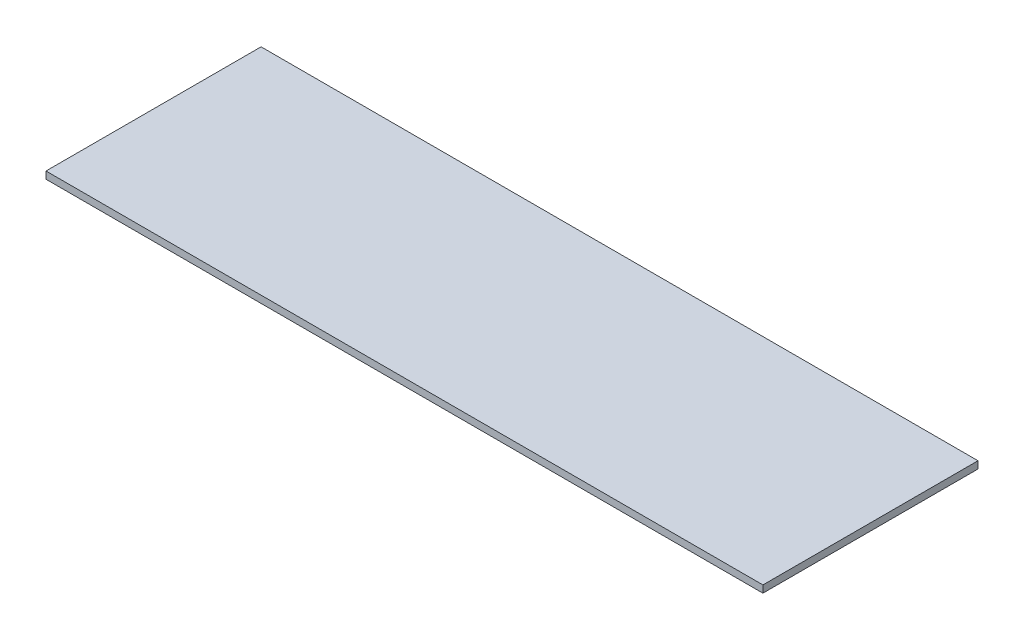
ISO-10303-21;
HEADER;
FILE_DESCRIPTION(('STEP AP214'),'2;1');
FILE_NAME('part.step','',(''),(''),'','','');
FILE_SCHEMA(('AUTOMOTIVE_DESIGN { 1 0 10303 214 1 1 1 1 }'));
ENDSEC;
DATA;
#1=APPLICATION_CONTEXT('core data for automotive mechanical design processes');
#2=APPLICATION_PROTOCOL_DEFINITION('international standard','automotive_design',2000,#1);
#3=PRODUCT_CONTEXT('',#1,'mechanical');
#4=PRODUCT('Part','Part','',(#3));
#5=PRODUCT_RELATED_PRODUCT_CATEGORY('part','',(#4));
#6=PRODUCT_DEFINITION_FORMATION('','',#4);
#7=PRODUCT_DEFINITION_CONTEXT('part definition',#1,'design');
#8=PRODUCT_DEFINITION('design','',#6,#7);
#9=PRODUCT_DEFINITION_SHAPE('','',#8);
#10=(LENGTH_UNIT() NAMED_UNIT(*) SI_UNIT(.MILLI.,.METRE.));
#11=(NAMED_UNIT(*) PLANE_ANGLE_UNIT() SI_UNIT($,.RADIAN.));
#12=(NAMED_UNIT(*) SI_UNIT($,.STERADIAN.) SOLID_ANGLE_UNIT());
#13=UNCERTAINTY_MEASURE_WITH_UNIT(LENGTH_MEASURE(1.E-05),#10,'distance_accuracy_value','');
#14=(GEOMETRIC_REPRESENTATION_CONTEXT(3) GLOBAL_UNCERTAINTY_ASSIGNED_CONTEXT((#13)) GLOBAL_UNIT_ASSIGNED_CONTEXT((#10,
#11,#12)) REPRESENTATION_CONTEXT('',''));
#15=CARTESIAN_POINT('',(0.,0.,0.));
#16=DIRECTION('',(0.,0.,1.));
#17=DIRECTION('',(1.,0.,0.));
#18=AXIS2_PLACEMENT_3D('',#15,#16,#17);
#19=CARTESIAN_POINT('',(-120.34632034632,2.,-34.6320346320346));
#20=DIRECTION('',(1.,0.,0.));
#21=DIRECTION('',(0.,0.,-1.));
#22=AXIS2_PLACEMENT_3D('',#19,#20,#21);
#23=PLANE('',#22);
#24=DIRECTION('',(0.,0.,1.));
#25=VECTOR('',#24,1.);
#26=CARTESIAN_POINT('',(-120.34632034632,0.,-34.6320346320346));
#27=LINE('',#26,#25);
#28=CARTESIAN_POINT('',(-120.34632034632,0.,-34.6320346320346));
#29=VERTEX_POINT('',#28);
#30=CARTESIAN_POINT('',(-120.34632034632,0.,25.3679653679654));
#31=VERTEX_POINT('',#30);
#32=EDGE_CURVE('E105',#29,#31,#27,.T.);
#33=ORIENTED_EDGE('',*,*,#32,.T.);
#34=DIRECTION('',(0.,-1.,0.));
#35=VECTOR('',#34,1.);
#36=CARTESIAN_POINT('',(-120.34632034632,2.,25.3679653679654));
#37=LINE('',#36,#35);
#38=CARTESIAN_POINT('',(-120.34632034632,2.,25.3679653679654));
#39=VERTEX_POINT('',#38);
#40=EDGE_CURVE('E11',#39,#31,#37,.T.);
#41=ORIENTED_EDGE('',*,*,#40,.F.);
#42=DIRECTION('',(0.,0.,1.));
#43=VECTOR('',#42,1.);
#44=CARTESIAN_POINT('',(-120.34632034632,2.,-34.6320346320346));
#45=LINE('',#44,#43);
#46=CARTESIAN_POINT('',(-120.34632034632,2.,-34.6320346320346));
#47=VERTEX_POINT('',#46);
#48=EDGE_CURVE('E89',#47,#39,#45,.T.);
#49=ORIENTED_EDGE('',*,*,#48,.F.);
#50=DIRECTION('',(0.,-1.,0.));
#51=VECTOR('',#50,1.);
#52=CARTESIAN_POINT('',(-120.34632034632,2.,-34.6320346320346));
#53=LINE('',#52,#51);
#54=EDGE_CURVE('E97',#47,#29,#53,.T.);
#55=ORIENTED_EDGE('',*,*,#54,.T.);
#56=EDGE_LOOP('',(#33,#41,#49,#55));
#57=FACE_BOUND('',#56,.T.);
#58=ADVANCED_FACE('F39',(#57),#23,.F.);
#59=CARTESIAN_POINT('',(-120.34632034632,2.,25.3679653679654));
#60=DIRECTION('',(0.,0.,-1.));
#61=DIRECTION('',(-1.,0.,0.));
#62=AXIS2_PLACEMENT_3D('',#59,#60,#61);
#63=PLANE('',#62);
#64=DIRECTION('',(1.,0.,0.));
#65=VECTOR('',#64,1.);
#66=CARTESIAN_POINT('',(-120.34632034632,0.,25.3679653679654));
#67=LINE('',#66,#65);
#68=CARTESIAN_POINT('',(79.6536796536797,0.,25.3679653679654));
#69=VERTEX_POINT('',#68);
#70=EDGE_CURVE('E92',#31,#69,#67,.T.);
#71=ORIENTED_EDGE('',*,*,#70,.T.);
#72=DIRECTION('',(0.,-1.,0.));
#73=VECTOR('',#72,1.);
#74=CARTESIAN_POINT('',(79.6536796536797,2.,25.3679653679654));
#75=LINE('',#74,#73);
#76=CARTESIAN_POINT('',(79.6536796536797,2.,25.3679653679654));
#77=VERTEX_POINT('',#76);
#78=EDGE_CURVE('E50',#77,#69,#75,.T.);
#79=ORIENTED_EDGE('',*,*,#78,.F.);
#80=DIRECTION('',(1.,0.,0.));
#81=VECTOR('',#80,1.);
#82=CARTESIAN_POINT('',(-120.34632034632,2.,25.3679653679654));
#83=LINE('',#82,#81);
#84=EDGE_CURVE('E82',#39,#77,#83,.T.);
#85=ORIENTED_EDGE('',*,*,#84,.F.);
#86=ORIENTED_EDGE('',*,*,#40,.T.);
#87=EDGE_LOOP('',(#71,#79,#85,#86));
#88=FACE_BOUND('',#87,.T.);
#89=ADVANCED_FACE('F93',(#88),#63,.F.);
#90=CARTESIAN_POINT('',(79.6536796536796,2.,-34.6320346320346));
#91=DIRECTION('',(-1.,0.,0.));
#92=DIRECTION('',(0.,0.,1.));
#93=AXIS2_PLACEMENT_3D('',#90,#91,#92);
#94=PLANE('',#93);
#95=DIRECTION('',(0.,0.,-1.));
#96=VECTOR('',#95,1.);
#97=CARTESIAN_POINT('',(79.6536796536796,0.,-34.6320346320346));
#98=LINE('',#97,#96);
#99=CARTESIAN_POINT('',(79.6536796536796,0.,-34.6320346320346));
#100=VERTEX_POINT('',#99);
#101=EDGE_CURVE('E72',#69,#100,#98,.T.);
#102=ORIENTED_EDGE('',*,*,#101,.T.);
#103=DIRECTION('',(0.,-1.,0.));
#104=VECTOR('',#103,1.);
#105=CARTESIAN_POINT('',(79.6536796536796,2.,-34.6320346320346));
#106=LINE('',#105,#104);
#107=CARTESIAN_POINT('',(79.6536796536796,2.,-34.6320346320346));
#108=VERTEX_POINT('',#107);
#109=EDGE_CURVE('E94',#108,#100,#106,.T.);
#110=ORIENTED_EDGE('',*,*,#109,.F.);
#111=DIRECTION('',(0.,0.,-1.));
#112=VECTOR('',#111,1.);
#113=CARTESIAN_POINT('',(79.6536796536796,2.,-34.6320346320346));
#114=LINE('',#113,#112);
#115=EDGE_CURVE('E88',#77,#108,#114,.T.);
#116=ORIENTED_EDGE('',*,*,#115,.F.);
#117=ORIENTED_EDGE('',*,*,#78,.T.);
#118=EDGE_LOOP('',(#102,#110,#116,#117));
#119=FACE_BOUND('',#118,.T.);
#120=ADVANCED_FACE('F96',(#119),#94,.F.);
#121=CARTESIAN_POINT('',(-120.34632034632,2.,-34.6320346320346));
#122=DIRECTION('',(0.,0.,1.));
#123=DIRECTION('',(1.,0.,0.));
#124=AXIS2_PLACEMENT_3D('',#121,#122,#123);
#125=PLANE('',#124);
#126=DIRECTION('',(-1.,0.,0.));
#127=VECTOR('',#126,1.);
#128=CARTESIAN_POINT('',(-120.34632034632,0.,-34.6320346320346));
#129=LINE('',#128,#127);
#130=EDGE_CURVE('E76',#100,#29,#129,.T.);
#131=ORIENTED_EDGE('',*,*,#130,.T.);
#132=ORIENTED_EDGE('',*,*,#54,.F.);
#133=DIRECTION('',(-1.,0.,0.));
#134=VECTOR('',#133,1.);
#135=CARTESIAN_POINT('',(-120.34632034632,2.,-34.6320346320346));
#136=LINE('',#135,#134);
#137=EDGE_CURVE('E54',#108,#47,#136,.T.);
#138=ORIENTED_EDGE('',*,*,#137,.F.);
#139=ORIENTED_EDGE('',*,*,#109,.T.);
#140=EDGE_LOOP('',(#131,#132,#138,#139));
#141=FACE_BOUND('',#140,.T.);
#142=ADVANCED_FACE('F108',(#141),#125,.F.);
#143=CARTESIAN_POINT('',(0.,2.,0.));
#144=DIRECTION('',(0.,1.,0.));
#145=DIRECTION('',(0.,0.,1.));
#146=AXIS2_PLACEMENT_3D('',#143,#144,#145);
#147=PLANE('',#146);
#148=ORIENTED_EDGE('',*,*,#48,.T.);
#149=ORIENTED_EDGE('',*,*,#84,.T.);
#150=ORIENTED_EDGE('',*,*,#115,.T.);
#151=ORIENTED_EDGE('',*,*,#137,.T.);
#152=EDGE_LOOP('',(#148,#149,#150,#151));
#153=FACE_BOUND('',#152,.T.);
#154=ADVANCED_FACE('F86',(#153),#147,.T.);
#155=CARTESIAN_POINT('',(0.,0.,0.));
#156=DIRECTION('',(0.,1.,0.));
#157=DIRECTION('',(0.,0.,1.));
#158=AXIS2_PLACEMENT_3D('',#155,#156,#157);
#159=PLANE('',#158);
#160=ORIENTED_EDGE('',*,*,#32,.F.);
#161=ORIENTED_EDGE('',*,*,#130,.F.);
#162=ORIENTED_EDGE('',*,*,#101,.F.);
#163=ORIENTED_EDGE('',*,*,#70,.F.);
#164=EDGE_LOOP('',(#160,#161,#162,#163));
#165=FACE_BOUND('',#164,.T.);
#166=ADVANCED_FACE('F115',(#165),#159,.F.);
#167=CLOSED_SHELL('',(#58,#89,#120,#142,#154,#166));
#168=MANIFOLD_SOLID_BREP('B2',#167);
#169=ADVANCED_BREP_SHAPE_REPRESENTATION('',(#18,#168),#14);
#170=SHAPE_DEFINITION_REPRESENTATION(#9,#169);
ENDSEC;
END-ISO-10303-21;
